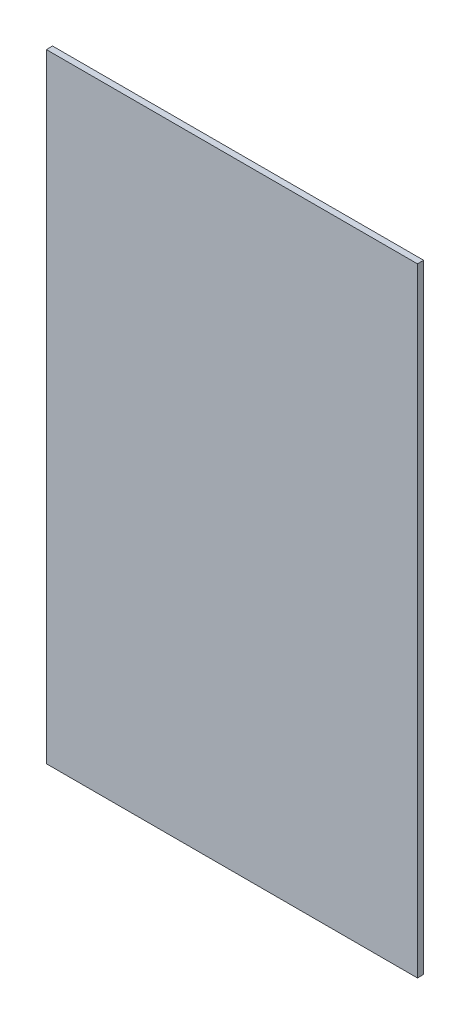
ISO-10303-21;
HEADER;
FILE_DESCRIPTION(('STEP AP214'),'2;1');
FILE_NAME('part.step','',(''),(''),'','','');
FILE_SCHEMA(('AUTOMOTIVE_DESIGN { 1 0 10303 214 1 1 1 1 }'));
ENDSEC;
DATA;
#1=APPLICATION_CONTEXT('core data for automotive mechanical design processes');
#2=APPLICATION_PROTOCOL_DEFINITION('international standard','automotive_design',2000,#1);
#3=PRODUCT_CONTEXT('',#1,'mechanical');
#4=PRODUCT('Part','Part','',(#3));
#5=PRODUCT_RELATED_PRODUCT_CATEGORY('part','',(#4));
#6=PRODUCT_DEFINITION_FORMATION('','',#4);
#7=PRODUCT_DEFINITION_CONTEXT('part definition',#1,'design');
#8=PRODUCT_DEFINITION('design','',#6,#7);
#9=PRODUCT_DEFINITION_SHAPE('','',#8);
#10=(LENGTH_UNIT() NAMED_UNIT(*) SI_UNIT(.MILLI.,.METRE.));
#11=(NAMED_UNIT(*) PLANE_ANGLE_UNIT() SI_UNIT($,.RADIAN.));
#12=(NAMED_UNIT(*) SI_UNIT($,.STERADIAN.) SOLID_ANGLE_UNIT());
#13=UNCERTAINTY_MEASURE_WITH_UNIT(LENGTH_MEASURE(1.E-05),#10,'distance_accuracy_value','');
#14=(GEOMETRIC_REPRESENTATION_CONTEXT(3) GLOBAL_UNCERTAINTY_ASSIGNED_CONTEXT((#13)) GLOBAL_UNIT_ASSIGNED_CONTEXT((#10,
#11,#12)) REPRESENTATION_CONTEXT('',''));
#15=CARTESIAN_POINT('',(0.,0.,0.));
#16=DIRECTION('',(0.,0.,1.));
#17=DIRECTION('',(1.,0.,0.));
#18=AXIS2_PLACEMENT_3D('',#15,#16,#17);
#19=CARTESIAN_POINT('',(150.,-250.,5.));
#20=DIRECTION('',(-1.,0.,0.));
#21=DIRECTION('',(0.,0.,1.));
#22=AXIS2_PLACEMENT_3D('',#19,#20,#21);
#23=PLANE('',#22);
#24=DIRECTION('',(0.,1.,0.));
#25=VECTOR('',#24,1.);
#26=CARTESIAN_POINT('',(150.,-250.,0.));
#27=LINE('',#26,#25);
#28=CARTESIAN_POINT('',(150.,-250.,0.));
#29=VERTEX_POINT('',#28);
#30=CARTESIAN_POINT('',(150.,250.,0.));
#31=VERTEX_POINT('',#30);
#32=EDGE_CURVE('E107',#29,#31,#27,.T.);
#33=ORIENTED_EDGE('',*,*,#32,.T.);
#34=DIRECTION('',(0.,0.,-1.));
#35=VECTOR('',#34,1.);
#36=CARTESIAN_POINT('',(150.,250.,5.));
#37=LINE('',#36,#35);
#38=CARTESIAN_POINT('',(150.,250.,5.));
#39=VERTEX_POINT('',#38);
#40=EDGE_CURVE('E11',#39,#31,#37,.T.);
#41=ORIENTED_EDGE('',*,*,#40,.F.);
#42=DIRECTION('',(0.,1.,0.));
#43=VECTOR('',#42,1.);
#44=CARTESIAN_POINT('',(150.,-250.,5.));
#45=LINE('',#44,#43);
#46=CARTESIAN_POINT('',(150.,-250.,5.));
#47=VERTEX_POINT('',#46);
#48=EDGE_CURVE('E91',#47,#39,#45,.T.);
#49=ORIENTED_EDGE('',*,*,#48,.F.);
#50=DIRECTION('',(0.,0.,-1.));
#51=VECTOR('',#50,1.);
#52=CARTESIAN_POINT('',(150.,-250.,5.));
#53=LINE('',#52,#51);
#54=EDGE_CURVE('E103',#47,#29,#53,.T.);
#55=ORIENTED_EDGE('',*,*,#54,.T.);
#56=EDGE_LOOP('',(#33,#41,#49,#55));
#57=FACE_BOUND('',#56,.T.);
#58=ADVANCED_FACE('F39',(#57),#23,.F.);
#59=CARTESIAN_POINT('',(-150.,250.,5.));
#60=DIRECTION('',(0.,-1.,0.));
#61=DIRECTION('',(0.,0.,-1.));
#62=AXIS2_PLACEMENT_3D('',#59,#60,#61);
#63=PLANE('',#62);
#64=DIRECTION('',(-1.,0.,0.));
#65=VECTOR('',#64,1.);
#66=CARTESIAN_POINT('',(-150.,250.,0.));
#67=LINE('',#66,#65);
#68=CARTESIAN_POINT('',(-150.,250.,0.));
#69=VERTEX_POINT('',#68);
#70=EDGE_CURVE('E96',#31,#69,#67,.T.);
#71=ORIENTED_EDGE('',*,*,#70,.T.);
#72=DIRECTION('',(0.,0.,-1.));
#73=VECTOR('',#72,1.);
#74=CARTESIAN_POINT('',(-150.,250.,5.));
#75=LINE('',#74,#73);
#76=CARTESIAN_POINT('',(-150.,250.,5.));
#77=VERTEX_POINT('',#76);
#78=EDGE_CURVE('E48',#77,#69,#75,.T.);
#79=ORIENTED_EDGE('',*,*,#78,.F.);
#80=DIRECTION('',(-1.,0.,0.));
#81=VECTOR('',#80,1.);
#82=CARTESIAN_POINT('',(-150.,250.,5.));
#83=LINE('',#82,#81);
#84=EDGE_CURVE('E86',#39,#77,#83,.T.);
#85=ORIENTED_EDGE('',*,*,#84,.F.);
#86=ORIENTED_EDGE('',*,*,#40,.T.);
#87=EDGE_LOOP('',(#71,#79,#85,#86));
#88=FACE_BOUND('',#87,.T.);
#89=ADVANCED_FACE('F95',(#88),#63,.F.);
#90=CARTESIAN_POINT('',(-150.,-250.,5.));
#91=DIRECTION('',(1.,0.,0.));
#92=DIRECTION('',(0.,0.,-1.));
#93=AXIS2_PLACEMENT_3D('',#90,#91,#92);
#94=PLANE('',#93);
#95=DIRECTION('',(0.,-1.,0.));
#96=VECTOR('',#95,1.);
#97=CARTESIAN_POINT('',(-150.,-250.,0.));
#98=LINE('',#97,#96);
#99=CARTESIAN_POINT('',(-150.,-250.,0.));
#100=VERTEX_POINT('',#99);
#101=EDGE_CURVE('E73',#69,#100,#98,.T.);
#102=ORIENTED_EDGE('',*,*,#101,.T.);
#103=DIRECTION('',(0.,0.,-1.));
#104=VECTOR('',#103,1.);
#105=CARTESIAN_POINT('',(-150.,-250.,5.));
#106=LINE('',#105,#104);
#107=CARTESIAN_POINT('',(-150.,-250.,5.));
#108=VERTEX_POINT('',#107);
#109=EDGE_CURVE('E98',#108,#100,#106,.T.);
#110=ORIENTED_EDGE('',*,*,#109,.F.);
#111=DIRECTION('',(0.,-1.,0.));
#112=VECTOR('',#111,1.);
#113=CARTESIAN_POINT('',(-150.,-250.,5.));
#114=LINE('',#113,#112);
#115=EDGE_CURVE('E89',#77,#108,#114,.T.);
#116=ORIENTED_EDGE('',*,*,#115,.F.);
#117=ORIENTED_EDGE('',*,*,#78,.T.);
#118=EDGE_LOOP('',(#102,#110,#116,#117));
#119=FACE_BOUND('',#118,.T.);
#120=ADVANCED_FACE('F99',(#119),#94,.F.);
#121=CARTESIAN_POINT('',(-150.,-250.,5.));
#122=DIRECTION('',(0.,1.,0.));
#123=DIRECTION('',(0.,0.,1.));
#124=AXIS2_PLACEMENT_3D('',#121,#122,#123);
#125=PLANE('',#124);
#126=DIRECTION('',(1.,0.,0.));
#127=VECTOR('',#126,1.);
#128=CARTESIAN_POINT('',(-150.,-250.,0.));
#129=LINE('',#128,#127);
#130=EDGE_CURVE('E79',#100,#29,#129,.T.);
#131=ORIENTED_EDGE('',*,*,#130,.T.);
#132=ORIENTED_EDGE('',*,*,#54,.F.);
#133=DIRECTION('',(1.,0.,0.));
#134=VECTOR('',#133,1.);
#135=CARTESIAN_POINT('',(-150.,-250.,5.));
#136=LINE('',#135,#134);
#137=EDGE_CURVE('E56',#108,#47,#136,.T.);
#138=ORIENTED_EDGE('',*,*,#137,.F.);
#139=ORIENTED_EDGE('',*,*,#109,.T.);
#140=EDGE_LOOP('',(#131,#132,#138,#139));
#141=FACE_BOUND('',#140,.T.);
#142=ADVANCED_FACE('F120',(#141),#125,.F.);
#143=CARTESIAN_POINT('',(0.,0.,5.));
#144=DIRECTION('',(0.,0.,-1.));
#145=DIRECTION('',(-1.,0.,0.));
#146=AXIS2_PLACEMENT_3D('',#143,#144,#145);
#147=PLANE('',#146);
#148=ORIENTED_EDGE('',*,*,#48,.T.);
#149=ORIENTED_EDGE('',*,*,#84,.T.);
#150=ORIENTED_EDGE('',*,*,#115,.T.);
#151=ORIENTED_EDGE('',*,*,#137,.T.);
#152=EDGE_LOOP('',(#148,#149,#150,#151));
#153=FACE_BOUND('',#152,.T.);
#154=ADVANCED_FACE('F87',(#153),#147,.F.);
#155=CARTESIAN_POINT('',(0.,0.,0.));
#156=DIRECTION('',(0.,0.,-1.));
#157=DIRECTION('',(-1.,0.,0.));
#158=AXIS2_PLACEMENT_3D('',#155,#156,#157);
#159=PLANE('',#158);
#160=ORIENTED_EDGE('',*,*,#32,.F.);
#161=ORIENTED_EDGE('',*,*,#130,.F.);
#162=ORIENTED_EDGE('',*,*,#101,.F.);
#163=ORIENTED_EDGE('',*,*,#70,.F.);
#164=EDGE_LOOP('',(#160,#161,#162,#163));
#165=FACE_BOUND('',#164,.T.);
#166=ADVANCED_FACE('F123',(#165),#159,.T.);
#167=CLOSED_SHELL('',(#58,#89,#120,#142,#154,#166));
#168=MANIFOLD_SOLID_BREP('B2',#167);
#169=ADVANCED_BREP_SHAPE_REPRESENTATION('',(#18,#168),#14);
#170=SHAPE_DEFINITION_REPRESENTATION(#9,#169);
ENDSEC;
END-ISO-10303-21;
